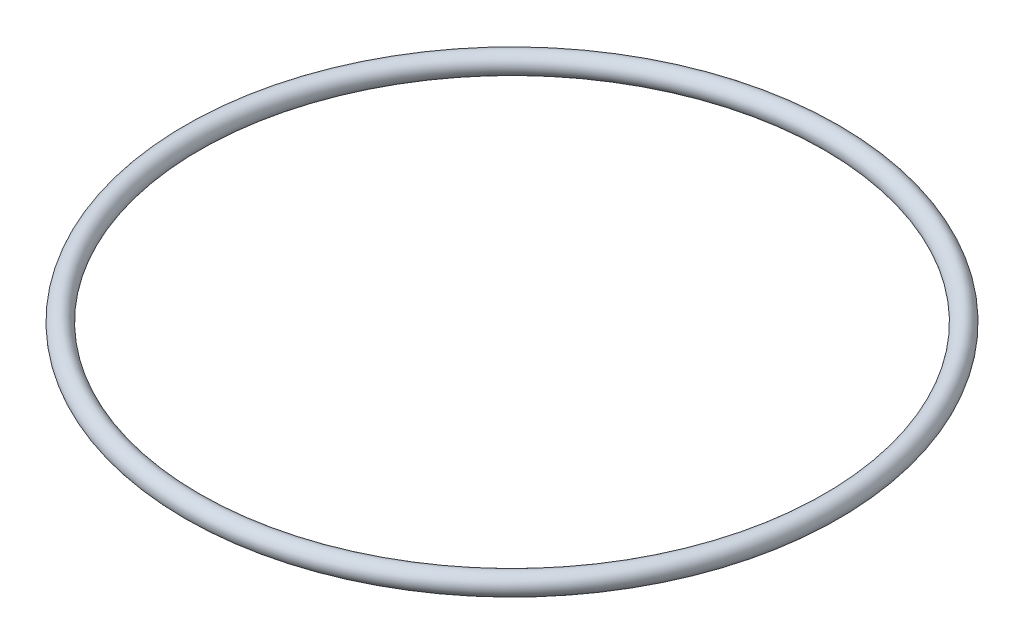
ISO-10303-21;
HEADER;
FILE_DESCRIPTION(('STEP AP214'),'2;1');
FILE_NAME('part.step','',(''),(''),'','','');
FILE_SCHEMA(('AUTOMOTIVE_DESIGN { 1 0 10303 214 1 1 1 1 }'));
ENDSEC;
DATA;
#1=APPLICATION_CONTEXT('core data for automotive mechanical design processes');
#2=APPLICATION_PROTOCOL_DEFINITION('international standard','automotive_design',2000,#1);
#3=PRODUCT_CONTEXT('',#1,'mechanical');
#4=PRODUCT('Part','Part','',(#3));
#5=PRODUCT_RELATED_PRODUCT_CATEGORY('part','',(#4));
#6=PRODUCT_DEFINITION_FORMATION('','',#4);
#7=PRODUCT_DEFINITION_CONTEXT('part definition',#1,'design');
#8=PRODUCT_DEFINITION('design','',#6,#7);
#9=PRODUCT_DEFINITION_SHAPE('','',#8);
#10=(LENGTH_UNIT() NAMED_UNIT(*) SI_UNIT(.MILLI.,.METRE.));
#11=(NAMED_UNIT(*) PLANE_ANGLE_UNIT() SI_UNIT($,.RADIAN.));
#12=(NAMED_UNIT(*) SI_UNIT($,.STERADIAN.) SOLID_ANGLE_UNIT());
#13=UNCERTAINTY_MEASURE_WITH_UNIT(LENGTH_MEASURE(1.E-05),#10,'distance_accuracy_value','');
#14=(GEOMETRIC_REPRESENTATION_CONTEXT(3) GLOBAL_UNCERTAINTY_ASSIGNED_CONTEXT((#13)) GLOBAL_UNIT_ASSIGNED_CONTEXT((#10,
#11,#12)) REPRESENTATION_CONTEXT('',''));
#15=CARTESIAN_POINT('',(0.,0.,0.));
#16=DIRECTION('',(0.,0.,1.));
#17=DIRECTION('',(1.,0.,0.));
#18=AXIS2_PLACEMENT_3D('',#15,#16,#17);
#19=CARTESIAN_POINT('',(0.,0.,0.));
#20=DIRECTION('',(0.,1.,0.));
#21=DIRECTION('',(0.,0.,1.));
#22=AXIS2_PLACEMENT_3D('',#19,#20,#21);
#23=TOROIDAL_SURFACE('',#22,135.7,4.3);
#24=CARTESIAN_POINT('',(0.,0.,140.));
#25=VERTEX_POINT('',#24);
#26=VERTEX_LOOP('',#25);
#27=FACE_BOUND('',#26,.T.);
#28=ADVANCED_FACE('F35',(#27),#23,.T.);
#29=CLOSED_SHELL('',(#28));
#30=MANIFOLD_SOLID_BREP('B2',#29);
#31=ADVANCED_BREP_SHAPE_REPRESENTATION('',(#18,#30),#14);
#32=SHAPE_DEFINITION_REPRESENTATION(#9,#31);
ENDSEC;
END-ISO-10303-21;
